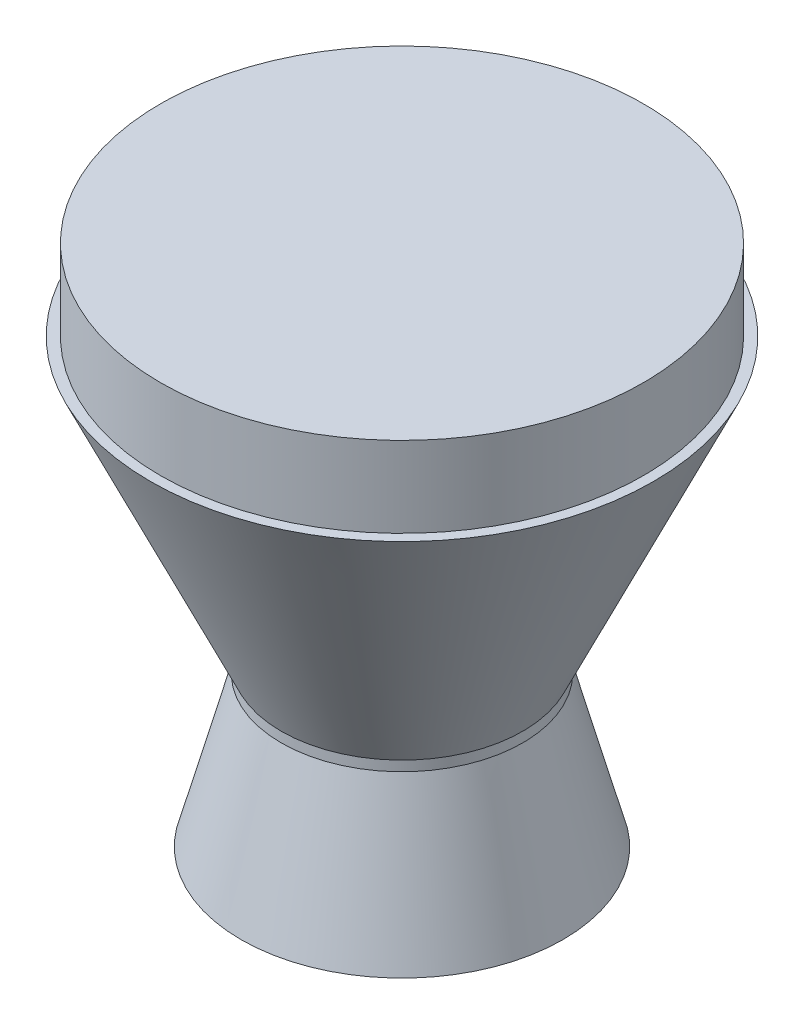
ISO-10303-21;
HEADER;
FILE_DESCRIPTION(('STEP AP214'),'2;1');
FILE_NAME('part.step','',(''),(''),'','','');
FILE_SCHEMA(('AUTOMOTIVE_DESIGN { 1 0 10303 214 1 1 1 1 }'));
ENDSEC;
DATA;
#1=APPLICATION_CONTEXT('core data for automotive mechanical design processes');
#2=APPLICATION_PROTOCOL_DEFINITION('international standard','automotive_design',2000,#1);
#3=PRODUCT_CONTEXT('',#1,'mechanical');
#4=PRODUCT('Part','Part','',(#3));
#5=PRODUCT_RELATED_PRODUCT_CATEGORY('part','',(#4));
#6=PRODUCT_DEFINITION_FORMATION('','',#4);
#7=PRODUCT_DEFINITION_CONTEXT('part definition',#1,'design');
#8=PRODUCT_DEFINITION('design','',#6,#7);
#9=PRODUCT_DEFINITION_SHAPE('','',#8);
#10=(LENGTH_UNIT() NAMED_UNIT(*) SI_UNIT(.MILLI.,.METRE.));
#11=(NAMED_UNIT(*) PLANE_ANGLE_UNIT() SI_UNIT($,.RADIAN.));
#12=(NAMED_UNIT(*) SI_UNIT($,.STERADIAN.) SOLID_ANGLE_UNIT());
#13=UNCERTAINTY_MEASURE_WITH_UNIT(LENGTH_MEASURE(1.E-05),#10,'distance_accuracy_value','');
#14=(GEOMETRIC_REPRESENTATION_CONTEXT(3) GLOBAL_UNCERTAINTY_ASSIGNED_CONTEXT((#13)) GLOBAL_UNIT_ASSIGNED_CONTEXT((#10,
#11,#12)) REPRESENTATION_CONTEXT('',''));
#15=CARTESIAN_POINT('',(0.,0.,0.));
#16=DIRECTION('',(0.,0.,1.));
#17=DIRECTION('',(1.,0.,0.));
#18=AXIS2_PLACEMENT_3D('',#15,#16,#17);
#19=CARTESIAN_POINT('',(0.,0.,-76.2000000000001));
#20=DIRECTION('',(0.,-1.,0.));
#21=DIRECTION('',(0.,0.,-1.));
#22=AXIS2_PLACEMENT_3D('',#19,#20,#21);
#23=PLANE('',#22);
#24=CARTESIAN_POINT('',(0.,0.,0.));
#25=DIRECTION('',(0.,1.,0.));
#26=DIRECTION('',(0.,0.,1.));
#27=AXIS2_PLACEMENT_3D('',#24,#25,#26);
#28=CIRCLE('',#27,76.2000000000001);
#29=CARTESIAN_POINT('',(0.,0.,76.2000000000001));
#30=VERTEX_POINT('',#29);
#31=EDGE_CURVE('E64',#30,#30,#28,.T.);
#32=ORIENTED_EDGE('',*,*,#31,.T.);
#33=EDGE_LOOP('',(#32));
#34=FACE_BOUND('',#33,.T.);
#35=ADVANCED_FACE('F37',(#34),#23,.F.);
#36=CARTESIAN_POINT('',(0.,-164.872045256125,0.));
#37=DIRECTION('',(0.,1.,0.));
#38=DIRECTION('',(0.,0.,1.));
#39=AXIS2_PLACEMENT_3D('',#36,#37,#38);
#40=PLANE('',#39);
#41=CARTESIAN_POINT('',(0.,-164.872045256125,0.));
#42=DIRECTION('',(0.,1.,0.));
#43=DIRECTION('',(0.,0.,1.));
#44=AXIS2_PLACEMENT_3D('',#41,#42,#43);
#45=CIRCLE('',#44,47.512998127198);
#46=CARTESIAN_POINT('',(0.,-164.872045256125,47.5129981271979));
#47=VERTEX_POINT('',#46);
#48=EDGE_CURVE('E68',#47,#47,#45,.T.);
#49=ORIENTED_EDGE('',*,*,#48,.T.);
#50=EDGE_LOOP('',(#49));
#51=FACE_BOUND('',#50,.T.);
#52=CARTESIAN_POINT('',(0.,-164.872045256125,0.));
#53=DIRECTION('',(0.,1.,0.));
#54=DIRECTION('',(0.,0.,1.));
#55=AXIS2_PLACEMENT_3D('',#52,#53,#54);
#56=CIRCLE('',#55,50.8);
#57=CARTESIAN_POINT('',(0.,-164.872045256125,50.7999999999999));
#58=VERTEX_POINT('',#57);
#59=EDGE_CURVE('E10',#58,#58,#56,.T.);
#60=ORIENTED_EDGE('',*,*,#59,.F.);
#61=EDGE_LOOP('',(#60));
#62=FACE_BOUND('',#61,.T.);
#63=ADVANCED_FACE('F112',(#51,#62),#40,.F.);
#64=CARTESIAN_POINT('',(0.,-164.872045256125,0.));
#65=DIRECTION('',(0.,-1.,0.));
#66=DIRECTION('',(0.,0.,-1.));
#67=AXIS2_PLACEMENT_3D('',#64,#65,#66);
#68=CONICAL_SURFACE('',#67,50.8,0.26179938779915);
#69=CARTESIAN_POINT('',(0.,-117.475,0.));
#70=DIRECTION('',(0.,1.,0.));
#71=DIRECTION('',(0.,0.,1.));
#72=AXIS2_PLACEMENT_3D('',#69,#70,#71);
#73=CIRCLE('',#72,38.1);
#74=CARTESIAN_POINT('',(0.,-117.475,38.1));
#75=VERTEX_POINT('',#74);
#76=EDGE_CURVE('E44',#75,#75,#73,.T.);
#77=ORIENTED_EDGE('',*,*,#76,.F.);
#78=EDGE_LOOP('',(#77));
#79=FACE_BOUND('',#78,.T.);
#80=ORIENTED_EDGE('',*,*,#59,.T.);
#81=EDGE_LOOP('',(#80));
#82=FACE_BOUND('',#81,.T.);
#83=ADVANCED_FACE('F117',(#79,#82),#68,.T.);
#84=CARTESIAN_POINT('',(0.,0.,0.));
#85=DIRECTION('',(0.,1.,0.));
#86=DIRECTION('',(0.,0.,1.));
#87=AXIS2_PLACEMENT_3D('',#84,#85,#86);
#88=CYLINDRICAL_SURFACE('',#87,38.1);
#89=CARTESIAN_POINT('',(0.,-114.3,0.));
#90=DIRECTION('',(0.,1.,0.));
#91=DIRECTION('',(0.,0.,1.));
#92=AXIS2_PLACEMENT_3D('',#89,#90,#91);
#93=CIRCLE('',#92,38.1);
#94=CARTESIAN_POINT('',(0.,-114.3,38.1));
#95=VERTEX_POINT('',#94);
#96=EDGE_CURVE('E49',#95,#95,#93,.T.);
#97=ORIENTED_EDGE('',*,*,#96,.F.);
#98=EDGE_LOOP('',(#97));
#99=FACE_BOUND('',#98,.T.);
#100=ORIENTED_EDGE('',*,*,#76,.T.);
#101=EDGE_LOOP('',(#100));
#102=FACE_BOUND('',#101,.T.);
#103=ADVANCED_FACE('F131',(#99,#102),#88,.T.);
#104=CARTESIAN_POINT('',(0.,-114.3,0.));
#105=DIRECTION('',(0.,1.,0.));
#106=DIRECTION('',(0.,0.,1.));
#107=AXIS2_PLACEMENT_3D('',#104,#105,#106);
#108=CONICAL_SURFACE('',#107,38.1,0.434670215149244);
#109=CARTESIAN_POINT('',(0.,-25.4,0.));
#110=DIRECTION('',(0.,1.,0.));
#111=DIRECTION('',(0.,0.,1.));
#112=AXIS2_PLACEMENT_3D('',#109,#110,#111);
#113=CIRCLE('',#112,79.375);
#114=CARTESIAN_POINT('',(0.,-25.4,79.375));
#115=VERTEX_POINT('',#114);
#116=EDGE_CURVE('E54',#115,#115,#113,.T.);
#117=ORIENTED_EDGE('',*,*,#116,.F.);
#118=EDGE_LOOP('',(#117));
#119=FACE_BOUND('',#118,.T.);
#120=ORIENTED_EDGE('',*,*,#96,.T.);
#121=EDGE_LOOP('',(#120));
#122=FACE_BOUND('',#121,.T.);
#123=ADVANCED_FACE('F125',(#119,#122),#108,.T.);
#124=CARTESIAN_POINT('',(0.,-25.4,-79.375));
#125=DIRECTION('',(0.,-1.,0.));
#126=DIRECTION('',(0.,0.,-1.));
#127=AXIS2_PLACEMENT_3D('',#124,#125,#126);
#128=PLANE('',#127);
#129=CARTESIAN_POINT('',(0.,-25.4,0.));
#130=DIRECTION('',(0.,1.,0.));
#131=DIRECTION('',(0.,0.,1.));
#132=AXIS2_PLACEMENT_3D('',#129,#130,#131);
#133=CIRCLE('',#132,76.2);
#134=CARTESIAN_POINT('',(0.,-25.4,76.2));
#135=VERTEX_POINT('',#134);
#136=EDGE_CURVE('E60',#135,#135,#133,.T.);
#137=ORIENTED_EDGE('',*,*,#136,.F.);
#138=EDGE_LOOP('',(#137));
#139=FACE_BOUND('',#138,.T.);
#140=ORIENTED_EDGE('',*,*,#116,.T.);
#141=EDGE_LOOP('',(#140));
#142=FACE_BOUND('',#141,.T.);
#143=ADVANCED_FACE('F108',(#139,#142),#128,.F.);
#144=CARTESIAN_POINT('',(0.,0.,0.));
#145=DIRECTION('',(0.,1.,0.));
#146=DIRECTION('',(0.,0.,1.));
#147=AXIS2_PLACEMENT_3D('',#144,#145,#146);
#148=CYLINDRICAL_SURFACE('',#147,76.2);
#149=ORIENTED_EDGE('',*,*,#31,.F.);
#150=EDGE_LOOP('',(#149));
#151=FACE_BOUND('',#150,.T.);
#152=ORIENTED_EDGE('',*,*,#136,.T.);
#153=EDGE_LOOP('',(#152));
#154=FACE_BOUND('',#153,.T.);
#155=ADVANCED_FACE('F99',(#151,#154),#148,.T.);
#156=CARTESIAN_POINT('',(0.,-3.17499999999998,-76.2000000000001));
#157=DIRECTION('',(0.,-1.,0.));
#158=DIRECTION('',(0.,0.,-1.));
#159=AXIS2_PLACEMENT_3D('',#156,#157,#158);
#160=PLANE('',#159);
#161=CARTESIAN_POINT('',(0.,-3.175,0.));
#162=DIRECTION('',(0.,-1.,0.));
#163=DIRECTION('',(0.,0.,-1.));
#164=AXIS2_PLACEMENT_3D('',#161,#162,#163);
#165=CIRCLE('',#164,73.025);
#166=CARTESIAN_POINT('',(0.,-3.17499999999998,-73.025));
#167=VERTEX_POINT('',#166);
#168=EDGE_CURVE('E88',#167,#167,#165,.F.);
#169=ORIENTED_EDGE('',*,*,#168,.F.);
#170=EDGE_LOOP('',(#169));
#171=FACE_BOUND('',#170,.T.);
#172=ADVANCED_FACE('F96',(#171),#160,.T.);
#173=CARTESIAN_POINT('',(0.,-165.693795724325,0.));
#174=DIRECTION('',(0.,-1.,0.));
#175=DIRECTION('',(0.,0.,-1.));
#176=AXIS2_PLACEMENT_3D('',#173,#174,#175);
#177=CONICAL_SURFACE('',#176,47.7331855015322,0.26179938779915);
#178=CARTESIAN_POINT('',(0.,-117.89299667984,0.));
#179=DIRECTION('',(0.,-1.,0.));
#180=DIRECTION('',(0.,0.,-1.));
#181=AXIS2_PLACEMENT_3D('',#178,#179,#180);
#182=CIRCLE('',#181,34.925);
#183=CARTESIAN_POINT('',(0.,-117.89299667984,-34.925));
#184=VERTEX_POINT('',#183);
#185=EDGE_CURVE('E72',#184,#184,#182,.F.);
#186=ORIENTED_EDGE('',*,*,#185,.T.);
#187=EDGE_LOOP('',(#186));
#188=FACE_BOUND('',#187,.T.);
#189=ORIENTED_EDGE('',*,*,#48,.F.);
#190=EDGE_LOOP('',(#189));
#191=FACE_BOUND('',#190,.T.);
#192=ADVANCED_FACE('F98',(#188,#191),#177,.F.);
#193=CARTESIAN_POINT('',(0.,0.,0.));
#194=DIRECTION('',(0.,1.,0.));
#195=DIRECTION('',(0.,0.,1.));
#196=AXIS2_PLACEMENT_3D('',#193,#194,#195);
#197=CYLINDRICAL_SURFACE('',#196,34.925);
#198=CARTESIAN_POINT('',(0.,-113.598887199481,0.));
#199=DIRECTION('',(0.,1.,0.));
#200=DIRECTION('',(0.,0.,1.));
#201=AXIS2_PLACEMENT_3D('',#198,#199,#200);
#202=CIRCLE('',#201,34.925);
#203=CARTESIAN_POINT('',(0.,-113.598887199481,34.925));
#204=VERTEX_POINT('',#203);
#205=EDGE_CURVE('E76',#204,#204,#202,.T.);
#206=ORIENTED_EDGE('',*,*,#205,.T.);
#207=EDGE_LOOP('',(#206));
#208=FACE_BOUND('',#207,.T.);
#209=ORIENTED_EDGE('',*,*,#185,.F.);
#210=EDGE_LOOP('',(#209));
#211=FACE_BOUND('',#210,.T.);
#212=ADVANCED_FACE('F105',(#208,#211),#197,.F.);
#213=CARTESIAN_POINT('',(0.,-112.962971602007,0.));
#214=DIRECTION('',(0.,1.,0.));
#215=DIRECTION('',(0.,0.,1.));
#216=AXIS2_PLACEMENT_3D('',#213,#214,#215);
#217=CONICAL_SURFACE('',#216,35.2202465273987,0.434670215149244);
#218=CARTESIAN_POINT('',(0.,-28.575,0.));
#219=DIRECTION('',(0.,-1.,0.));
#220=DIRECTION('',(0.,0.,-1.));
#221=AXIS2_PLACEMENT_3D('',#218,#219,#220);
#222=CIRCLE('',#221,74.4003761997589);
#223=CARTESIAN_POINT('',(0.,-28.575,-74.4003761997589));
#224=VERTEX_POINT('',#223);
#225=EDGE_CURVE('E80',#224,#224,#222,.F.);
#226=ORIENTED_EDGE('',*,*,#225,.T.);
#227=EDGE_LOOP('',(#226));
#228=FACE_BOUND('',#227,.T.);
#229=ORIENTED_EDGE('',*,*,#205,.F.);
#230=EDGE_LOOP('',(#229));
#231=FACE_BOUND('',#230,.T.);
#232=ADVANCED_FACE('F148',(#228,#231),#217,.F.);
#233=CARTESIAN_POINT('',(0.,-28.575,-79.375));
#234=DIRECTION('',(0.,-1.,0.));
#235=DIRECTION('',(0.,0.,-1.));
#236=AXIS2_PLACEMENT_3D('',#233,#234,#235);
#237=PLANE('',#236);
#238=CARTESIAN_POINT('',(0.,-28.575,0.));
#239=DIRECTION('',(0.,-1.,0.));
#240=DIRECTION('',(0.,0.,-1.));
#241=AXIS2_PLACEMENT_3D('',#238,#239,#240);
#242=CIRCLE('',#241,73.025);
#243=CARTESIAN_POINT('',(0.,-28.575,-73.025));
#244=VERTEX_POINT('',#243);
#245=EDGE_CURVE('E84',#244,#244,#242,.F.);
#246=ORIENTED_EDGE('',*,*,#245,.T.);
#247=EDGE_LOOP('',(#246));
#248=FACE_BOUND('',#247,.T.);
#249=ORIENTED_EDGE('',*,*,#225,.F.);
#250=EDGE_LOOP('',(#249));
#251=FACE_BOUND('',#250,.T.);
#252=ADVANCED_FACE('F145',(#248,#251),#237,.T.);
#253=CARTESIAN_POINT('',(0.,0.,0.));
#254=DIRECTION('',(0.,1.,0.));
#255=DIRECTION('',(0.,0.,1.));
#256=AXIS2_PLACEMENT_3D('',#253,#254,#255);
#257=CYLINDRICAL_SURFACE('',#256,73.025);
#258=ORIENTED_EDGE('',*,*,#168,.T.);
#259=EDGE_LOOP('',(#258));
#260=FACE_BOUND('',#259,.T.);
#261=ORIENTED_EDGE('',*,*,#245,.F.);
#262=EDGE_LOOP('',(#261));
#263=FACE_BOUND('',#262,.T.);
#264=ADVANCED_FACE('F93',(#260,#263),#257,.F.);
#265=CLOSED_SHELL('',(#35,#63,#83,#103,#123,#143,#155,#172,#192,#212,#232,#252,#264));
#266=MANIFOLD_SOLID_BREP('B2',#265);
#267=ADVANCED_BREP_SHAPE_REPRESENTATION('',(#18,#266),#14);
#268=SHAPE_DEFINITION_REPRESENTATION(#9,#267);
ENDSEC;
END-ISO-10303-21;
